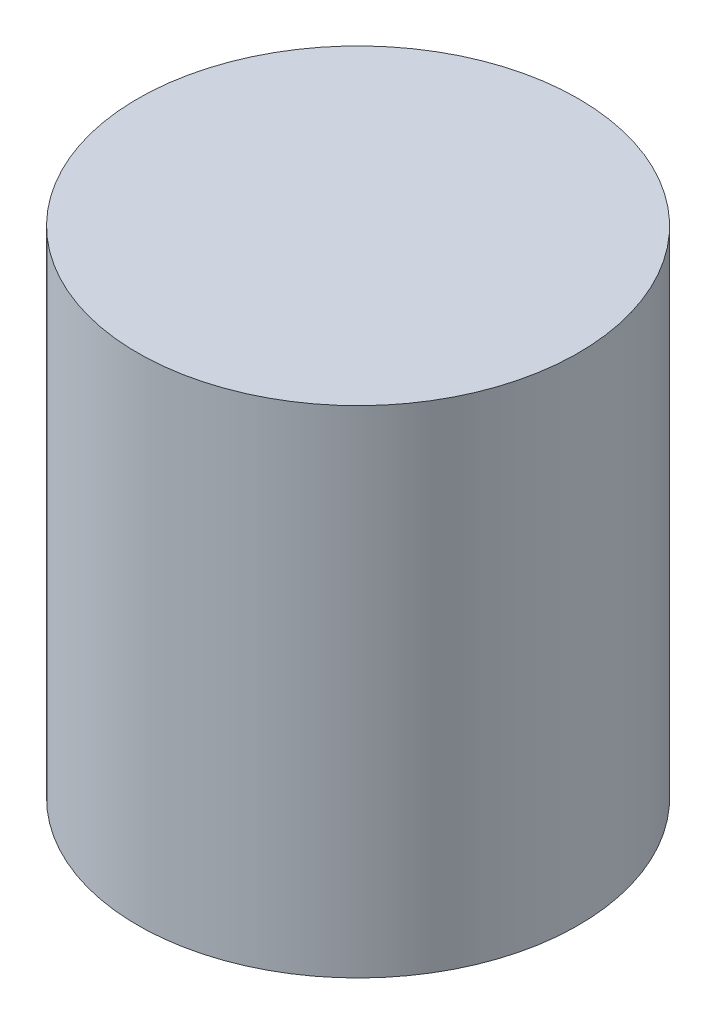
ISO-10303-21;
HEADER;
FILE_DESCRIPTION(('STEP AP214'),'2;1');
FILE_NAME('part.step','',(''),(''),'','','');
FILE_SCHEMA(('AUTOMOTIVE_DESIGN { 1 0 10303 214 1 1 1 1 }'));
ENDSEC;
DATA;
#1=APPLICATION_CONTEXT('core data for automotive mechanical design processes');
#2=APPLICATION_PROTOCOL_DEFINITION('international standard','automotive_design',2000,#1);
#3=PRODUCT_CONTEXT('',#1,'mechanical');
#4=PRODUCT('Part','Part','',(#3));
#5=PRODUCT_RELATED_PRODUCT_CATEGORY('part','',(#4));
#6=PRODUCT_DEFINITION_FORMATION('','',#4);
#7=PRODUCT_DEFINITION_CONTEXT('part definition',#1,'design');
#8=PRODUCT_DEFINITION('design','',#6,#7);
#9=PRODUCT_DEFINITION_SHAPE('','',#8);
#10=(LENGTH_UNIT() NAMED_UNIT(*) SI_UNIT(.MILLI.,.METRE.));
#11=(NAMED_UNIT(*) PLANE_ANGLE_UNIT() SI_UNIT($,.RADIAN.));
#12=(NAMED_UNIT(*) SI_UNIT($,.STERADIAN.) SOLID_ANGLE_UNIT());
#13=UNCERTAINTY_MEASURE_WITH_UNIT(LENGTH_MEASURE(1.E-05),#10,'distance_accuracy_value','');
#14=(GEOMETRIC_REPRESENTATION_CONTEXT(3) GLOBAL_UNCERTAINTY_ASSIGNED_CONTEXT((#13)) GLOBAL_UNIT_ASSIGNED_CONTEXT((#10,
#11,#12)) REPRESENTATION_CONTEXT('',''));
#15=CARTESIAN_POINT('',(0.,0.,0.));
#16=DIRECTION('',(0.,0.,1.));
#17=DIRECTION('',(1.,0.,0.));
#18=AXIS2_PLACEMENT_3D('',#15,#16,#17);
#19=CARTESIAN_POINT('',(0.,45.,0.));
#20=DIRECTION('',(0.,-1.,0.));
#21=DIRECTION('',(0.,0.,-1.));
#22=AXIS2_PLACEMENT_3D('',#19,#20,#21);
#23=CYLINDRICAL_SURFACE('',#22,20.);
#24=CARTESIAN_POINT('',(0.,45.,0.));
#25=DIRECTION('',(0.,1.,0.));
#26=DIRECTION('',(0.,0.,1.));
#27=AXIS2_PLACEMENT_3D('',#24,#25,#26);
#28=CIRCLE('',#27,20.);
#29=CARTESIAN_POINT('',(0.,45.,-20.));
#30=VERTEX_POINT('',#29);
#31=EDGE_CURVE('E10',#30,#30,#28,.T.);
#32=CARTESIAN_POINT('',(0.,0.,0.));
#33=DIRECTION('',(0.,1.,0.));
#34=DIRECTION('',(0.,0.,1.));
#35=AXIS2_PLACEMENT_3D('',#32,#33,#34);
#36=CIRCLE('',#35,20.);
#37=CARTESIAN_POINT('',(0.,0.,-20.));
#38=VERTEX_POINT('',#37);
#39=EDGE_CURVE('E37',#38,#38,#36,.T.);
#40=CARTESIAN_POINT('',(0.,45.,-20.));
#41=CARTESIAN_POINT('',(0.,44.53125,-20.));
#42=CARTESIAN_POINT('',(0.,44.0625,-20.));
#43=CARTESIAN_POINT('',(0.,43.125,-20.));
#44=CARTESIAN_POINT('',(0.,42.65625,-20.));
#45=CARTESIAN_POINT('',(0.,41.71875,-20.));
#46=CARTESIAN_POINT('',(0.,41.25,-20.));
#47=CARTESIAN_POINT('',(0.,40.3125,-20.));
#48=CARTESIAN_POINT('',(0.,39.84375,-20.));
#49=CARTESIAN_POINT('',(0.,38.90625,-20.));
#50=CARTESIAN_POINT('',(0.,38.4375,-20.));
#51=CARTESIAN_POINT('',(0.,37.5,-20.));
#52=CARTESIAN_POINT('',(0.,37.03125,-20.));
#53=CARTESIAN_POINT('',(0.,36.09375,-20.));
#54=CARTESIAN_POINT('',(0.,35.625,-20.));
#55=CARTESIAN_POINT('',(0.,34.6875,-20.));
#56=CARTESIAN_POINT('',(0.,34.21875,-20.));
#57=CARTESIAN_POINT('',(0.,33.28125,-20.));
#58=CARTESIAN_POINT('',(0.,32.8125,-20.));
#59=CARTESIAN_POINT('',(0.,31.875,-20.));
#60=CARTESIAN_POINT('',(0.,31.40625,-20.));
#61=CARTESIAN_POINT('',(0.,30.46875,-20.));
#62=CARTESIAN_POINT('',(0.,30.,-20.));
#63=CARTESIAN_POINT('',(0.,29.0625,-20.));
#64=CARTESIAN_POINT('',(0.,28.59375,-20.));
#65=CARTESIAN_POINT('',(0.,27.65625,-20.));
#66=CARTESIAN_POINT('',(0.,27.1875,-20.));
#67=CARTESIAN_POINT('',(0.,26.25,-20.));
#68=CARTESIAN_POINT('',(0.,25.78125,-20.));
#69=CARTESIAN_POINT('',(0.,24.84375,-20.));
#70=CARTESIAN_POINT('',(0.,24.375,-20.));
#71=CARTESIAN_POINT('',(0.,23.4375,-20.));
#72=CARTESIAN_POINT('',(0.,22.96875,-20.));
#73=CARTESIAN_POINT('',(0.,22.03125,-20.));
#74=CARTESIAN_POINT('',(0.,21.5625,-20.));
#75=CARTESIAN_POINT('',(0.,20.625,-20.));
#76=CARTESIAN_POINT('',(0.,20.15625,-20.));
#77=CARTESIAN_POINT('',(0.,19.21875,-20.));
#78=CARTESIAN_POINT('',(0.,18.75,-20.));
#79=CARTESIAN_POINT('',(0.,17.8125,-20.));
#80=CARTESIAN_POINT('',(0.,17.34375,-20.));
#81=CARTESIAN_POINT('',(0.,16.40625,-20.));
#82=CARTESIAN_POINT('',(0.,15.9375,-20.));
#83=CARTESIAN_POINT('',(0.,15.,-20.));
#84=CARTESIAN_POINT('',(0.,14.53125,-20.));
#85=CARTESIAN_POINT('',(0.,13.59375,-20.));
#86=CARTESIAN_POINT('',(0.,13.125,-20.));
#87=CARTESIAN_POINT('',(0.,12.1875,-20.));
#88=CARTESIAN_POINT('',(0.,11.71875,-20.));
#89=CARTESIAN_POINT('',(0.,10.78125,-20.));
#90=CARTESIAN_POINT('',(0.,10.3125,-20.));
#91=CARTESIAN_POINT('',(0.,9.37499999999999,-20.));
#92=CARTESIAN_POINT('',(0.,8.90624999999999,-20.));
#93=CARTESIAN_POINT('',(0.,7.96874999999999,-20.));
#94=CARTESIAN_POINT('',(0.,7.5,-20.));
#95=CARTESIAN_POINT('',(0.,6.56249999999999,-20.));
#96=CARTESIAN_POINT('',(0.,6.09374999999999,-20.));
#97=CARTESIAN_POINT('',(0.,5.15624999999999,-20.));
#98=CARTESIAN_POINT('',(0.,4.68749999999999,-20.));
#99=CARTESIAN_POINT('',(0.,3.74999999999999,-20.));
#100=CARTESIAN_POINT('',(0.,3.28124999999999,-20.));
#101=CARTESIAN_POINT('',(0.,2.34374999999999,-20.));
#102=CARTESIAN_POINT('',(0.,1.87499999999999,-20.));
#103=CARTESIAN_POINT('',(0.,0.937499999999992,-20.));
#104=CARTESIAN_POINT('',(0.,0.468749999999993,-20.));
#105=CARTESIAN_POINT('',(0.,0.,-20.));
#106=B_SPLINE_CURVE_WITH_KNOTS('',3,(#40,#41,#42,#43,#44,#45,#46,#47,#48,#49,#50,#51,#52,#53,
#54,#55,#56,#57,#58,#59,#60,#61,#62,#63,#64,#65,#66,#67,#68,#69,#70,#71,#72,#73,#74,#75,#76,#77,
#78,#79,#80,#81,#82,#83,#84,#85,#86,#87,#88,#89,#90,#91,#92,#93,#94,#95,#96,#97,#98,#99,#100,
#101,#102,#103,#104,#105),.UNSPECIFIED.,.F.,.F.,(4,2,2,2,2,2,2,2,2,2,2,2,2,2,2,2,2,2,2,2,2,2,2,
2,2,2,2,2,2,2,2,2,4),(0.,1.40625,2.8125,4.21874999999999,5.625,7.03125,8.43749999999999,9.84375,
11.25,12.65625,14.0625,15.46875,16.875,18.28125,19.6875,21.09375,22.5,23.90625,25.3125,26.71875,
28.125,29.53125,30.9375,32.34375,33.75,35.15625,36.5625,37.96875,39.375,40.78125,42.1875,
43.59375,45.),.UNSPECIFIED.);
#107=EDGE_CURVE('BSEAM34',#30,#38,#106,.T.);
#108=ORIENTED_EDGE('',*,*,#31,.F.);
#109=ORIENTED_EDGE('',*,*,#39,.T.);
#110=ORIENTED_EDGE('',*,*,#107,.T.);
#111=ORIENTED_EDGE('',*,*,#107,.F.);
#112=EDGE_LOOP('',(#108,#110,#109,#111));
#113=FACE_BOUND('',#112,.T.);
#114=ADVANCED_FACE('F34',(#113),#23,.T.);
#115=CARTESIAN_POINT('',(0.,45.,0.));
#116=DIRECTION('',(0.,1.,0.));
#117=DIRECTION('',(0.,0.,1.));
#118=AXIS2_PLACEMENT_3D('',#115,#116,#117);
#119=PLANE('',#118);
#120=ORIENTED_EDGE('',*,*,#31,.T.);
#121=EDGE_LOOP('',(#120));
#122=FACE_BOUND('',#121,.T.);
#123=ADVANCED_FACE('F49',(#122),#119,.T.);
#124=CARTESIAN_POINT('',(0.,0.,0.));
#125=DIRECTION('',(0.,1.,0.));
#126=DIRECTION('',(0.,0.,1.));
#127=AXIS2_PLACEMENT_3D('',#124,#125,#126);
#128=PLANE('',#127);
#129=ORIENTED_EDGE('',*,*,#39,.F.);
#130=EDGE_LOOP('',(#129));
#131=FACE_BOUND('',#130,.T.);
#132=ADVANCED_FACE('F47',(#131),#128,.F.);
#133=CLOSED_SHELL('',(#114,#123,#132));
#134=MANIFOLD_SOLID_BREP('B2',#133);
#135=ADVANCED_BREP_SHAPE_REPRESENTATION('',(#18,#134),#14);
#136=SHAPE_DEFINITION_REPRESENTATION(#9,#135);
ENDSEC;
END-ISO-10303-21;
